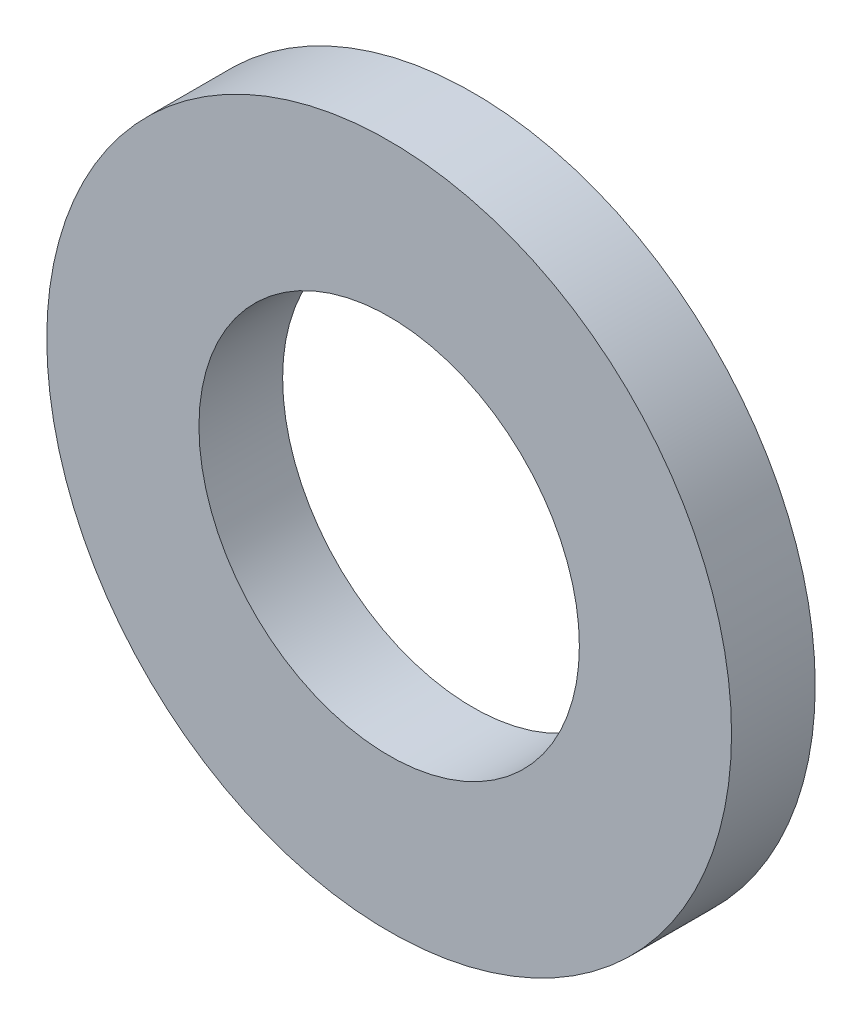
ISO-10303-21;
HEADER;
FILE_DESCRIPTION(('STEP AP214'),'2;1');
FILE_NAME('part.step','',(''),(''),'','','');
FILE_SCHEMA(('AUTOMOTIVE_DESIGN { 1 0 10303 214 1 1 1 1 }'));
ENDSEC;
DATA;
#1=APPLICATION_CONTEXT('core data for automotive mechanical design processes');
#2=APPLICATION_PROTOCOL_DEFINITION('international standard','automotive_design',2000,#1);
#3=PRODUCT_CONTEXT('',#1,'mechanical');
#4=PRODUCT('Part','Part','',(#3));
#5=PRODUCT_RELATED_PRODUCT_CATEGORY('part','',(#4));
#6=PRODUCT_DEFINITION_FORMATION('','',#4);
#7=PRODUCT_DEFINITION_CONTEXT('part definition',#1,'design');
#8=PRODUCT_DEFINITION('design','',#6,#7);
#9=PRODUCT_DEFINITION_SHAPE('','',#8);
#10=(LENGTH_UNIT() NAMED_UNIT(*) SI_UNIT(.MILLI.,.METRE.));
#11=(NAMED_UNIT(*) PLANE_ANGLE_UNIT() SI_UNIT($,.RADIAN.));
#12=(NAMED_UNIT(*) SI_UNIT($,.STERADIAN.) SOLID_ANGLE_UNIT());
#13=UNCERTAINTY_MEASURE_WITH_UNIT(LENGTH_MEASURE(1.E-05),#10,'distance_accuracy_value','');
#14=(GEOMETRIC_REPRESENTATION_CONTEXT(3) GLOBAL_UNCERTAINTY_ASSIGNED_CONTEXT((#13)) GLOBAL_UNIT_ASSIGNED_CONTEXT((#10,
#11,#12)) REPRESENTATION_CONTEXT('',''));
#15=CARTESIAN_POINT('',(0.,0.,0.));
#16=DIRECTION('',(0.,0.,1.));
#17=DIRECTION('',(1.,0.,0.));
#18=AXIS2_PLACEMENT_3D('',#15,#16,#17);
#19=CARTESIAN_POINT('',(0.,0.,5.5));
#20=DIRECTION('',(0.,0.,1.));
#21=DIRECTION('',(1.,0.,0.));
#22=AXIS2_PLACEMENT_3D('',#19,#20,#21);
#23=PLANE('',#22);
#24=CARTESIAN_POINT('',(0.,0.,5.5));
#25=DIRECTION('',(0.,0.,1.));
#26=DIRECTION('',(1.,0.,0.));
#27=AXIS2_PLACEMENT_3D('',#24,#25,#26);
#28=CIRCLE('',#27,22.5);
#29=CARTESIAN_POINT('',(22.5,0.,5.5));
#30=VERTEX_POINT('',#29);
#31=EDGE_CURVE('E10',#30,#30,#28,.T.);
#32=ORIENTED_EDGE('',*,*,#31,.T.);
#33=EDGE_LOOP('',(#32));
#34=FACE_BOUND('',#33,.T.);
#35=CARTESIAN_POINT('',(0.,0.,5.5));
#36=DIRECTION('',(0.,0.,1.));
#37=DIRECTION('',(1.,0.,0.));
#38=AXIS2_PLACEMENT_3D('',#35,#36,#37);
#39=CIRCLE('',#38,12.5);
#40=CARTESIAN_POINT('',(12.5,0.,5.5));
#41=VERTEX_POINT('',#40);
#42=EDGE_CURVE('E42',#41,#41,#39,.T.);
#43=ORIENTED_EDGE('',*,*,#42,.F.);
#44=EDGE_LOOP('',(#43));
#45=FACE_BOUND('',#44,.T.);
#46=ADVANCED_FACE('F31',(#34,#45),#23,.T.);
#47=CARTESIAN_POINT('',(0.,0.,0.));
#48=DIRECTION('',(0.,0.,1.));
#49=DIRECTION('',(1.,0.,0.));
#50=AXIS2_PLACEMENT_3D('',#47,#48,#49);
#51=PLANE('',#50);
#52=CARTESIAN_POINT('',(0.,0.,0.));
#53=DIRECTION('',(0.,0.,1.));
#54=DIRECTION('',(1.,0.,0.));
#55=AXIS2_PLACEMENT_3D('',#52,#53,#54);
#56=CIRCLE('',#55,22.5);
#57=CARTESIAN_POINT('',(22.5,0.,0.));
#58=VERTEX_POINT('',#57);
#59=EDGE_CURVE('E35',#58,#58,#56,.T.);
#60=ORIENTED_EDGE('',*,*,#59,.F.);
#61=EDGE_LOOP('',(#60));
#62=FACE_BOUND('',#61,.T.);
#63=CARTESIAN_POINT('',(0.,0.,0.));
#64=DIRECTION('',(0.,0.,1.));
#65=DIRECTION('',(1.,0.,0.));
#66=AXIS2_PLACEMENT_3D('',#63,#64,#65);
#67=CIRCLE('',#66,12.5);
#68=CARTESIAN_POINT('',(12.5,0.,0.));
#69=VERTEX_POINT('',#68);
#70=EDGE_CURVE('E44',#69,#69,#67,.T.);
#71=ORIENTED_EDGE('',*,*,#70,.T.);
#72=EDGE_LOOP('',(#71));
#73=FACE_BOUND('',#72,.T.);
#74=ADVANCED_FACE('F54',(#62,#73),#51,.F.);
#75=CARTESIAN_POINT('',(0.,0.,5.5));
#76=DIRECTION('',(0.,0.,-1.));
#77=DIRECTION('',(-1.,0.,0.));
#78=AXIS2_PLACEMENT_3D('',#75,#76,#77);
#79=CYLINDRICAL_SURFACE('',#78,22.5);
#80=ORIENTED_EDGE('',*,*,#31,.F.);
#81=EDGE_LOOP('',(#80));
#82=FACE_BOUND('',#81,.T.);
#83=ORIENTED_EDGE('',*,*,#59,.T.);
#84=EDGE_LOOP('',(#83));
#85=FACE_BOUND('',#84,.T.);
#86=ADVANCED_FACE('F33',(#82,#85),#79,.T.);
#87=CARTESIAN_POINT('',(0.,0.,5.5));
#88=DIRECTION('',(0.,0.,-1.));
#89=DIRECTION('',(-1.,0.,0.));
#90=AXIS2_PLACEMENT_3D('',#87,#88,#89);
#91=CYLINDRICAL_SURFACE('',#90,12.5);
#92=ORIENTED_EDGE('',*,*,#42,.T.);
#93=EDGE_LOOP('',(#92));
#94=FACE_BOUND('',#93,.T.);
#95=ORIENTED_EDGE('',*,*,#70,.F.);
#96=EDGE_LOOP('',(#95));
#97=FACE_BOUND('',#96,.T.);
#98=ADVANCED_FACE('F50',(#94,#97),#91,.F.);
#99=CLOSED_SHELL('',(#46,#74,#86,#98));
#100=MANIFOLD_SOLID_BREP('B2',#99);
#101=ADVANCED_BREP_SHAPE_REPRESENTATION('',(#18,#100),#14);
#102=SHAPE_DEFINITION_REPRESENTATION(#9,#101);
ENDSEC;
END-ISO-10303-21;
